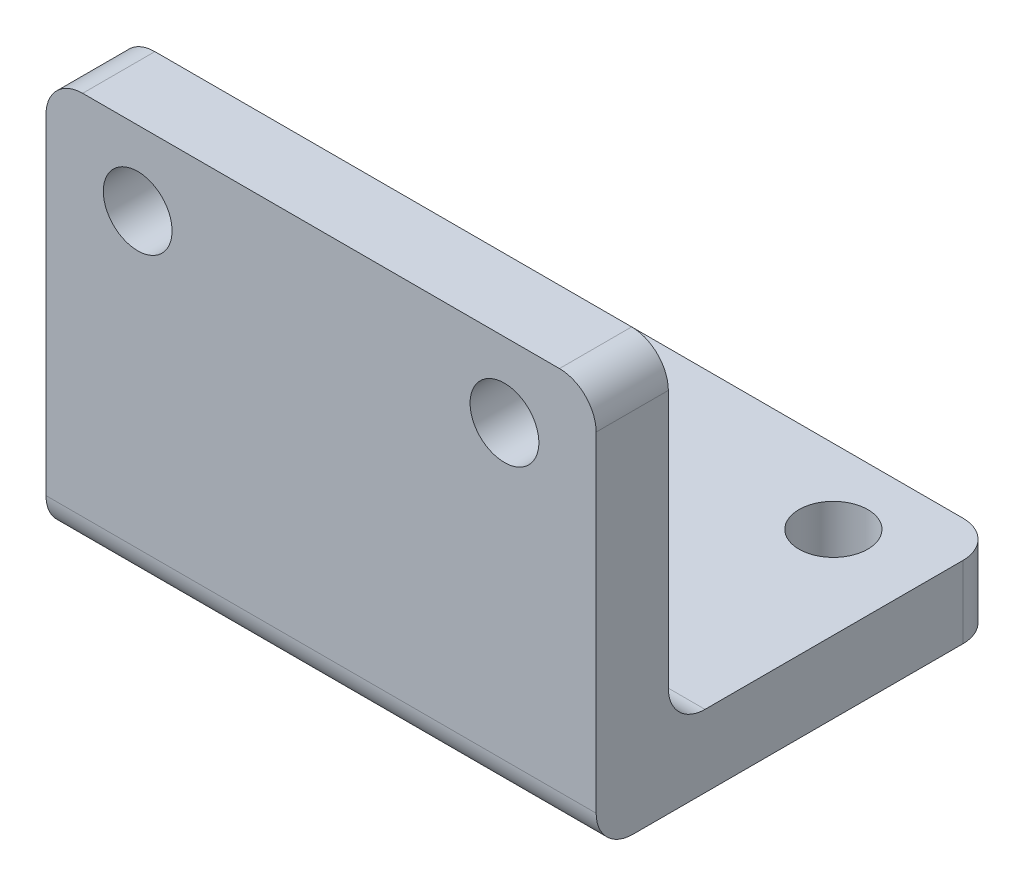
ISO-10303-21;
HEADER;
FILE_DESCRIPTION(('STEP AP214'),'2;1');
FILE_NAME('part.step','',(''),(''),'','','');
FILE_SCHEMA(('AUTOMOTIVE_DESIGN { 1 0 10303 214 1 1 1 1 }'));
ENDSEC;
DATA;
#1=APPLICATION_CONTEXT('core data for automotive mechanical design processes');
#2=APPLICATION_PROTOCOL_DEFINITION('international standard','automotive_design',2000,#1);
#3=PRODUCT_CONTEXT('',#1,'mechanical');
#4=PRODUCT('Part','Part','',(#3));
#5=PRODUCT_RELATED_PRODUCT_CATEGORY('part','',(#4));
#6=PRODUCT_DEFINITION_FORMATION('','',#4);
#7=PRODUCT_DEFINITION_CONTEXT('part definition',#1,'design');
#8=PRODUCT_DEFINITION('design','',#6,#7);
#9=PRODUCT_DEFINITION_SHAPE('','',#8);
#10=(LENGTH_UNIT() NAMED_UNIT(*) SI_UNIT(.MILLI.,.METRE.));
#11=(NAMED_UNIT(*) PLANE_ANGLE_UNIT() SI_UNIT($,.RADIAN.));
#12=(NAMED_UNIT(*) SI_UNIT($,.STERADIAN.) SOLID_ANGLE_UNIT());
#13=UNCERTAINTY_MEASURE_WITH_UNIT(LENGTH_MEASURE(1.E-05),#10,'distance_accuracy_value','');
#14=(GEOMETRIC_REPRESENTATION_CONTEXT(3) GLOBAL_UNCERTAINTY_ASSIGNED_CONTEXT((#13)) GLOBAL_UNIT_ASSIGNED_CONTEXT((#10,
#11,#12)) REPRESENTATION_CONTEXT('',''));
#15=CARTESIAN_POINT('',(0.,0.,0.));
#16=DIRECTION('',(0.,0.,1.));
#17=DIRECTION('',(1.,0.,0.));
#18=AXIS2_PLACEMENT_3D('',#15,#16,#17);
#19=CARTESIAN_POINT('',(38.1,5.,-5.));
#20=DIRECTION('',(0.,0.,1.));
#21=DIRECTION('',(1.,0.,0.));
#22=AXIS2_PLACEMENT_3D('',#19,#20,#21);
#23=PLANE('',#22);
#24=CARTESIAN_POINT('',(31.75,22.78,-5.));
#25=DIRECTION('',(0.,0.,-1.));
#26=DIRECTION('',(-1.,0.,0.));
#27=AXIS2_PLACEMENT_3D('',#24,#25,#26);
#28=CIRCLE('',#27,2.38125);
#29=CARTESIAN_POINT('',(29.36875,22.78,-5.));
#30=VERTEX_POINT('',#29);
#31=EDGE_CURVE('E284',#30,#30,#28,.T.);
#32=ORIENTED_EDGE('',*,*,#31,.F.);
#33=EDGE_LOOP('',(#32));
#34=FACE_BOUND('',#33,.T.);
#35=CARTESIAN_POINT('',(6.35000000000002,22.78,-5.));
#36=DIRECTION('',(0.,0.,-1.));
#37=DIRECTION('',(-1.,0.,0.));
#38=AXIS2_PLACEMENT_3D('',#35,#36,#37);
#39=CIRCLE('',#38,2.38125);
#40=CARTESIAN_POINT('',(3.96875000000001,22.78,-5.));
#41=VERTEX_POINT('',#40);
#42=EDGE_CURVE('E279',#41,#41,#39,.T.);
#43=ORIENTED_EDGE('',*,*,#42,.F.);
#44=EDGE_LOOP('',(#43));
#45=FACE_BOUND('',#44,.T.);
#46=DIRECTION('',(0.,1.,0.));
#47=VECTOR('',#46,1.);
#48=CARTESIAN_POINT('',(0.,5.,-5.));
#49=LINE('',#48,#47);
#50=CARTESIAN_POINT('',(0.,7.54,-5.));
#51=VERTEX_POINT('',#50);
#52=CARTESIAN_POINT('',(0.,25.4,-5.));
#53=VERTEX_POINT('',#52);
#54=EDGE_CURVE('E174',#51,#53,#49,.T.);
#55=ORIENTED_EDGE('',*,*,#54,.T.);
#56=CARTESIAN_POINT('',(2.54,25.4,-5.));
#57=DIRECTION('',(0.,0.,1.));
#58=DIRECTION('',(1.,0.,0.));
#59=AXIS2_PLACEMENT_3D('',#56,#57,#58);
#60=CIRCLE('',#59,2.54);
#61=CARTESIAN_POINT('',(2.54000000000001,27.94,-5.));
#62=VERTEX_POINT('',#61);
#63=EDGE_CURVE('E59',#53,#62,#60,.F.);
#64=ORIENTED_EDGE('',*,*,#63,.T.);
#65=DIRECTION('',(-1.,0.,0.));
#66=VECTOR('',#65,1.);
#67=CARTESIAN_POINT('',(38.1,27.94,-5.));
#68=LINE('',#67,#66);
#69=CARTESIAN_POINT('',(35.56,27.94,-5.));
#70=VERTEX_POINT('',#69);
#71=EDGE_CURVE('E241',#70,#62,#68,.T.);
#72=ORIENTED_EDGE('',*,*,#71,.F.);
#73=CARTESIAN_POINT('',(35.56,25.4,-5.));
#74=DIRECTION('',(0.,0.,1.));
#75=DIRECTION('',(1.,0.,0.));
#76=AXIS2_PLACEMENT_3D('',#73,#74,#75);
#77=CIRCLE('',#76,2.54);
#78=CARTESIAN_POINT('',(38.1,25.4,-5.));
#79=VERTEX_POINT('',#78);
#80=EDGE_CURVE('E151',#70,#79,#77,.F.);
#81=ORIENTED_EDGE('',*,*,#80,.T.);
#82=DIRECTION('',(0.,1.,0.));
#83=VECTOR('',#82,1.);
#84=CARTESIAN_POINT('',(38.1,5.,-5.));
#85=LINE('',#84,#83);
#86=CARTESIAN_POINT('',(38.1,7.54,-5.));
#87=VERTEX_POINT('',#86);
#88=EDGE_CURVE('E139',#87,#79,#85,.T.);
#89=ORIENTED_EDGE('',*,*,#88,.F.);
#90=DIRECTION('',(-1.,0.,0.));
#91=VECTOR('',#90,1.);
#92=CARTESIAN_POINT('',(0.,7.54,-5.));
#93=LINE('',#92,#91);
#94=EDGE_CURVE('E148',#87,#51,#93,.T.);
#95=ORIENTED_EDGE('',*,*,#94,.T.);
#96=EDGE_LOOP('',(#55,#64,#72,#81,#89,#95));
#97=FACE_BOUND('',#96,.T.);
#98=ADVANCED_FACE('F43',(#34,#45,#97),#23,.F.);
#99=CARTESIAN_POINT('',(38.1,27.94,0.));
#100=DIRECTION('',(0.,-1.,0.));
#101=DIRECTION('',(0.,0.,-1.));
#102=AXIS2_PLACEMENT_3D('',#99,#100,#101);
#103=PLANE('',#102);
#104=ORIENTED_EDGE('',*,*,#71,.T.);
#105=DIRECTION('',(0.,0.,1.));
#106=VECTOR('',#105,1.);
#107=CARTESIAN_POINT('',(2.54,27.94,0.));
#108=LINE('',#107,#106);
#109=CARTESIAN_POINT('',(2.54000000000001,27.94,0.));
#110=VERTEX_POINT('',#109);
#111=EDGE_CURVE('E224',#62,#110,#108,.T.);
#112=ORIENTED_EDGE('',*,*,#111,.T.);
#113=DIRECTION('',(-1.,0.,0.));
#114=VECTOR('',#113,1.);
#115=CARTESIAN_POINT('',(38.1,27.94,0.));
#116=LINE('',#115,#114);
#117=CARTESIAN_POINT('',(35.56,27.94,0.));
#118=VERTEX_POINT('',#117);
#119=EDGE_CURVE('E235',#118,#110,#116,.T.);
#120=ORIENTED_EDGE('',*,*,#119,.F.);
#121=DIRECTION('',(0.,0.,1.));
#122=VECTOR('',#121,1.);
#123=CARTESIAN_POINT('',(35.56,27.94,0.));
#124=LINE('',#123,#122);
#125=EDGE_CURVE('E66',#118,#70,#124,.F.);
#126=ORIENTED_EDGE('',*,*,#125,.T.);
#127=EDGE_LOOP('',(#104,#112,#120,#126));
#128=FACE_BOUND('',#127,.T.);
#129=ADVANCED_FACE('F238',(#128),#103,.F.);
#130=CARTESIAN_POINT('',(38.1,0.,0.));
#131=DIRECTION('',(0.,0.,-1.));
#132=DIRECTION('',(-1.,0.,0.));
#133=AXIS2_PLACEMENT_3D('',#130,#131,#132);
#134=PLANE('',#133);
#135=CARTESIAN_POINT('',(31.75,22.78,0.));
#136=DIRECTION('',(0.,0.,-1.));
#137=DIRECTION('',(-1.,0.,0.));
#138=AXIS2_PLACEMENT_3D('',#135,#136,#137);
#139=CIRCLE('',#138,2.38125);
#140=CARTESIAN_POINT('',(29.36875,22.78,0.));
#141=VERTEX_POINT('',#140);
#142=EDGE_CURVE('E267',#141,#141,#139,.T.);
#143=ORIENTED_EDGE('',*,*,#142,.T.);
#144=EDGE_LOOP('',(#143));
#145=FACE_BOUND('',#144,.T.);
#146=CARTESIAN_POINT('',(6.35000000000002,22.78,0.));
#147=DIRECTION('',(0.,0.,-1.));
#148=DIRECTION('',(-1.,0.,0.));
#149=AXIS2_PLACEMENT_3D('',#146,#147,#148);
#150=CIRCLE('',#149,2.38125);
#151=CARTESIAN_POINT('',(3.96875000000001,22.78,0.));
#152=VERTEX_POINT('',#151);
#153=EDGE_CURVE('E275',#152,#152,#150,.T.);
#154=ORIENTED_EDGE('',*,*,#153,.T.);
#155=EDGE_LOOP('',(#154));
#156=FACE_BOUND('',#155,.T.);
#157=ORIENTED_EDGE('',*,*,#119,.T.);
#158=CARTESIAN_POINT('',(2.54,25.4,0.));
#159=DIRECTION('',(0.,0.,-1.));
#160=DIRECTION('',(-1.,0.,0.));
#161=AXIS2_PLACEMENT_3D('',#158,#159,#160);
#162=CIRCLE('',#161,2.54);
#163=CARTESIAN_POINT('',(0.,25.4,0.));
#164=VERTEX_POINT('',#163);
#165=EDGE_CURVE('E158',#110,#164,#162,.F.);
#166=ORIENTED_EDGE('',*,*,#165,.T.);
#167=DIRECTION('',(0.,-1.,0.));
#168=VECTOR('',#167,1.);
#169=CARTESIAN_POINT('',(0.,0.,0.));
#170=LINE('',#169,#168);
#171=CARTESIAN_POINT('',(0.,2.54,0.));
#172=VERTEX_POINT('',#171);
#173=EDGE_CURVE('E261',#164,#172,#170,.T.);
#174=ORIENTED_EDGE('',*,*,#173,.T.);
#175=DIRECTION('',(-1.,0.,0.));
#176=VECTOR('',#175,1.);
#177=CARTESIAN_POINT('',(38.1,2.54,0.));
#178=LINE('',#177,#176);
#179=CARTESIAN_POINT('',(38.1,2.54,0.));
#180=VERTEX_POINT('',#179);
#181=EDGE_CURVE('E228',#172,#180,#178,.F.);
#182=ORIENTED_EDGE('',*,*,#181,.T.);
#183=DIRECTION('',(0.,-1.,0.));
#184=VECTOR('',#183,1.);
#185=CARTESIAN_POINT('',(38.1,0.,0.));
#186=LINE('',#185,#184);
#187=CARTESIAN_POINT('',(38.1,25.4,0.));
#188=VERTEX_POINT('',#187);
#189=EDGE_CURVE('E153',#188,#180,#186,.T.);
#190=ORIENTED_EDGE('',*,*,#189,.F.);
#191=CARTESIAN_POINT('',(35.56,25.4,0.));
#192=DIRECTION('',(0.,0.,-1.));
#193=DIRECTION('',(-1.,0.,0.));
#194=AXIS2_PLACEMENT_3D('',#191,#192,#193);
#195=CIRCLE('',#194,2.54);
#196=EDGE_CURVE('E163',#188,#118,#195,.F.);
#197=ORIENTED_EDGE('',*,*,#196,.T.);
#198=EDGE_LOOP('',(#157,#166,#174,#182,#190,#197));
#199=FACE_BOUND('',#198,.T.);
#200=ADVANCED_FACE('F234',(#145,#156,#199),#134,.F.);
#201=CARTESIAN_POINT('',(38.1,0.,0.));
#202=DIRECTION('',(0.,1.,0.));
#203=DIRECTION('',(0.,0.,1.));
#204=AXIS2_PLACEMENT_3D('',#201,#202,#203);
#205=PLANE('',#204);
#206=CARTESIAN_POINT('',(6.35000000000002,0.,-22.78));
#207=DIRECTION('',(0.,1.,0.));
#208=DIRECTION('',(0.,0.,1.));
#209=AXIS2_PLACEMENT_3D('',#206,#207,#208);
#210=CIRCLE('',#209,2.38125);
#211=CARTESIAN_POINT('',(6.35000000000002,0.,-20.39875));
#212=VERTEX_POINT('',#211);
#213=EDGE_CURVE('E280',#212,#212,#210,.T.);
#214=ORIENTED_EDGE('',*,*,#213,.T.);
#215=EDGE_LOOP('',(#214));
#216=FACE_BOUND('',#215,.T.);
#217=CARTESIAN_POINT('',(31.75,0.,-22.78));
#218=DIRECTION('',(0.,1.,0.));
#219=DIRECTION('',(0.,0.,1.));
#220=AXIS2_PLACEMENT_3D('',#217,#218,#219);
#221=CIRCLE('',#220,2.38125);
#222=CARTESIAN_POINT('',(31.75,0.,-20.39875));
#223=VERTEX_POINT('',#222);
#224=EDGE_CURVE('E291',#223,#223,#221,.T.);
#225=ORIENTED_EDGE('',*,*,#224,.T.);
#226=EDGE_LOOP('',(#225));
#227=FACE_BOUND('',#226,.T.);
#228=DIRECTION('',(-1.,0.,0.));
#229=VECTOR('',#228,1.);
#230=CARTESIAN_POINT('',(38.1,0.,-27.94));
#231=LINE('',#230,#229);
#232=CARTESIAN_POINT('',(35.56,0.,-27.94));
#233=VERTEX_POINT('',#232);
#234=CARTESIAN_POINT('',(2.54000000000001,0.,-27.94));
#235=VERTEX_POINT('',#234);
#236=EDGE_CURVE('E242',#233,#235,#231,.T.);
#237=ORIENTED_EDGE('',*,*,#236,.F.);
#238=CARTESIAN_POINT('',(35.56,0.,-25.4));
#239=DIRECTION('',(0.,1.,0.));
#240=DIRECTION('',(0.,0.,1.));
#241=AXIS2_PLACEMENT_3D('',#238,#239,#240);
#242=CIRCLE('',#241,2.54);
#243=CARTESIAN_POINT('',(38.1,0.,-25.4));
#244=VERTEX_POINT('',#243);
#245=EDGE_CURVE('E210',#233,#244,#242,.F.);
#246=ORIENTED_EDGE('',*,*,#245,.T.);
#247=DIRECTION('',(0.,0.,-1.));
#248=VECTOR('',#247,1.);
#249=CARTESIAN_POINT('',(38.1,0.,0.));
#250=LINE('',#249,#248);
#251=CARTESIAN_POINT('',(38.1,0.,-2.54));
#252=VERTEX_POINT('',#251);
#253=EDGE_CURVE('E270',#252,#244,#250,.T.);
#254=ORIENTED_EDGE('',*,*,#253,.F.);
#255=DIRECTION('',(-1.,0.,0.));
#256=VECTOR('',#255,1.);
#257=CARTESIAN_POINT('',(38.1,0.,-2.54));
#258=LINE('',#257,#256);
#259=CARTESIAN_POINT('',(0.,0.,-2.54));
#260=VERTEX_POINT('',#259);
#261=EDGE_CURVE('E203',#252,#260,#258,.T.);
#262=ORIENTED_EDGE('',*,*,#261,.T.);
#263=DIRECTION('',(0.,0.,-1.));
#264=VECTOR('',#263,1.);
#265=CARTESIAN_POINT('',(0.,0.,0.));
#266=LINE('',#265,#264);
#267=CARTESIAN_POINT('',(0.,0.,-25.4));
#268=VERTEX_POINT('',#267);
#269=EDGE_CURVE('E181',#260,#268,#266,.T.);
#270=ORIENTED_EDGE('',*,*,#269,.T.);
#271=CARTESIAN_POINT('',(2.54,0.,-25.4));
#272=DIRECTION('',(0.,1.,0.));
#273=DIRECTION('',(0.,0.,1.));
#274=AXIS2_PLACEMENT_3D('',#271,#272,#273);
#275=CIRCLE('',#274,2.54);
#276=EDGE_CURVE('E207',#268,#235,#275,.F.);
#277=ORIENTED_EDGE('',*,*,#276,.T.);
#278=EDGE_LOOP('',(#237,#246,#254,#262,#270,#277));
#279=FACE_BOUND('',#278,.T.);
#280=ADVANCED_FACE('F307',(#216,#227,#279),#205,.F.);
#281=CARTESIAN_POINT('',(38.1,0.,-27.94));
#282=DIRECTION('',(0.,0.,1.));
#283=DIRECTION('',(0.,-1.,0.));
#284=AXIS2_PLACEMENT_3D('',#281,#282,#283);
#285=PLANE('',#284);
#286=DIRECTION('',(-1.,0.,0.));
#287=VECTOR('',#286,1.);
#288=CARTESIAN_POINT('',(38.1,5.,-27.94));
#289=LINE('',#288,#287);
#290=CARTESIAN_POINT('',(35.56,5.,-27.94));
#291=VERTEX_POINT('',#290);
#292=CARTESIAN_POINT('',(2.54000000000001,5.,-27.94));
#293=VERTEX_POINT('',#292);
#294=EDGE_CURVE('E255',#291,#293,#289,.T.);
#295=ORIENTED_EDGE('',*,*,#294,.F.);
#296=DIRECTION('',(0.,1.,0.));
#297=VECTOR('',#296,1.);
#298=CARTESIAN_POINT('',(35.56,0.,-27.94));
#299=LINE('',#298,#297);
#300=EDGE_CURVE('E200',#291,#233,#299,.F.);
#301=ORIENTED_EDGE('',*,*,#300,.T.);
#302=ORIENTED_EDGE('',*,*,#236,.T.);
#303=DIRECTION('',(0.,1.,0.));
#304=VECTOR('',#303,1.);
#305=CARTESIAN_POINT('',(2.54,5.,-27.94));
#306=LINE('',#305,#304);
#307=EDGE_CURVE('E196',#235,#293,#306,.T.);
#308=ORIENTED_EDGE('',*,*,#307,.T.);
#309=EDGE_LOOP('',(#295,#301,#302,#308));
#310=FACE_BOUND('',#309,.T.);
#311=ADVANCED_FACE('F319',(#310),#285,.F.);
#312=CARTESIAN_POINT('',(38.1,5.,-5.));
#313=DIRECTION('',(0.,-1.,0.));
#314=DIRECTION('',(0.,0.,-1.));
#315=AXIS2_PLACEMENT_3D('',#312,#313,#314);
#316=PLANE('',#315);
#317=CARTESIAN_POINT('',(6.35000000000002,5.,-22.78));
#318=DIRECTION('',(0.,1.,0.));
#319=DIRECTION('',(0.,0.,1.));
#320=AXIS2_PLACEMENT_3D('',#317,#318,#319);
#321=CIRCLE('',#320,2.38125);
#322=CARTESIAN_POINT('',(6.35000000000002,5.,-20.39875));
#323=VERTEX_POINT('',#322);
#324=EDGE_CURVE('E299',#323,#323,#321,.T.);
#325=ORIENTED_EDGE('',*,*,#324,.F.);
#326=EDGE_LOOP('',(#325));
#327=FACE_BOUND('',#326,.T.);
#328=CARTESIAN_POINT('',(31.75,5.,-22.78));
#329=DIRECTION('',(0.,1.,0.));
#330=DIRECTION('',(0.,0.,1.));
#331=AXIS2_PLACEMENT_3D('',#328,#329,#330);
#332=CIRCLE('',#331,2.38125);
#333=CARTESIAN_POINT('',(31.75,5.,-20.39875));
#334=VERTEX_POINT('',#333);
#335=EDGE_CURVE('E295',#334,#334,#332,.T.);
#336=ORIENTED_EDGE('',*,*,#335,.F.);
#337=EDGE_LOOP('',(#336));
#338=FACE_BOUND('',#337,.T.);
#339=DIRECTION('',(0.,0.,1.));
#340=VECTOR('',#339,1.);
#341=CARTESIAN_POINT('',(38.1,5.,-5.));
#342=LINE('',#341,#340);
#343=CARTESIAN_POINT('',(38.1,5.,-25.4));
#344=VERTEX_POINT('',#343);
#345=CARTESIAN_POINT('',(38.1,5.,-7.54));
#346=VERTEX_POINT('',#345);
#347=EDGE_CURVE('E143',#344,#346,#342,.T.);
#348=ORIENTED_EDGE('',*,*,#347,.F.);
#349=CARTESIAN_POINT('',(35.56,5.,-25.4));
#350=DIRECTION('',(0.,-1.,0.));
#351=DIRECTION('',(0.,0.,-1.));
#352=AXIS2_PLACEMENT_3D('',#349,#350,#351);
#353=CIRCLE('',#352,2.54);
#354=EDGE_CURVE('E188',#344,#291,#353,.F.);
#355=ORIENTED_EDGE('',*,*,#354,.T.);
#356=ORIENTED_EDGE('',*,*,#294,.T.);
#357=CARTESIAN_POINT('',(2.54,5.,-25.4));
#358=DIRECTION('',(0.,-1.,0.));
#359=DIRECTION('',(0.,0.,-1.));
#360=AXIS2_PLACEMENT_3D('',#357,#358,#359);
#361=CIRCLE('',#360,2.54);
#362=CARTESIAN_POINT('',(0.,5.,-25.4));
#363=VERTEX_POINT('',#362);
#364=EDGE_CURVE('E179',#293,#363,#361,.F.);
#365=ORIENTED_EDGE('',*,*,#364,.T.);
#366=DIRECTION('',(0.,0.,1.));
#367=VECTOR('',#366,1.);
#368=CARTESIAN_POINT('',(0.,5.,-5.));
#369=LINE('',#368,#367);
#370=CARTESIAN_POINT('',(0.,5.,-7.54));
#371=VERTEX_POINT('',#370);
#372=EDGE_CURVE('E154',#363,#371,#369,.T.);
#373=ORIENTED_EDGE('',*,*,#372,.T.);
#374=DIRECTION('',(-1.,0.,0.));
#375=VECTOR('',#374,1.);
#376=CARTESIAN_POINT('',(38.1,5.,-7.54));
#377=LINE('',#376,#375);
#378=EDGE_CURVE('E177',#371,#346,#377,.F.);
#379=ORIENTED_EDGE('',*,*,#378,.T.);
#380=EDGE_LOOP('',(#348,#355,#356,#365,#373,#379));
#381=FACE_BOUND('',#380,.T.);
#382=ADVANCED_FACE('F176',(#327,#338,#381),#316,.F.);
#383=CARTESIAN_POINT('',(38.1,0.,0.));
#384=DIRECTION('',(-1.,0.,0.));
#385=DIRECTION('',(0.,0.,1.));
#386=AXIS2_PLACEMENT_3D('',#383,#384,#385);
#387=PLANE('',#386);
#388=ORIENTED_EDGE('',*,*,#253,.T.);
#389=DIRECTION('',(0.,1.,0.));
#390=VECTOR('',#389,1.);
#391=CARTESIAN_POINT('',(38.1,0.,-25.4));
#392=LINE('',#391,#390);
#393=EDGE_CURVE('E184',#244,#344,#392,.T.);
#394=ORIENTED_EDGE('',*,*,#393,.T.);
#395=ORIENTED_EDGE('',*,*,#347,.T.);
#396=CARTESIAN_POINT('',(38.1,7.54,-7.54));
#397=DIRECTION('',(-1.,0.,0.));
#398=DIRECTION('',(0.,0.,1.));
#399=AXIS2_PLACEMENT_3D('',#396,#397,#398);
#400=CIRCLE('',#399,2.54);
#401=EDGE_CURVE('E11',#346,#87,#400,.T.);
#402=ORIENTED_EDGE('',*,*,#401,.T.);
#403=ORIENTED_EDGE('',*,*,#88,.T.);
#404=DIRECTION('',(0.,0.,1.));
#405=VECTOR('',#404,1.);
#406=CARTESIAN_POINT('',(38.1,25.4,0.));
#407=LINE('',#406,#405);
#408=EDGE_CURVE('E190',#79,#188,#407,.T.);
#409=ORIENTED_EDGE('',*,*,#408,.T.);
#410=ORIENTED_EDGE('',*,*,#189,.T.);
#411=CARTESIAN_POINT('',(38.1,2.54,-2.54));
#412=DIRECTION('',(-1.,0.,0.));
#413=DIRECTION('',(0.,0.,1.));
#414=AXIS2_PLACEMENT_3D('',#411,#412,#413);
#415=CIRCLE('',#414,2.54);
#416=EDGE_CURVE('E246',#180,#252,#415,.F.);
#417=ORIENTED_EDGE('',*,*,#416,.T.);
#418=EDGE_LOOP('',(#388,#394,#395,#402,#403,#409,#410,#417));
#419=FACE_BOUND('',#418,.T.);
#420=ADVANCED_FACE('F137',(#419),#387,.F.);
#421=CARTESIAN_POINT('',(0.,0.,0.));
#422=DIRECTION('',(-1.,0.,0.));
#423=DIRECTION('',(0.,0.,1.));
#424=AXIS2_PLACEMENT_3D('',#421,#422,#423);
#425=PLANE('',#424);
#426=ORIENTED_EDGE('',*,*,#372,.F.);
#427=DIRECTION('',(0.,1.,0.));
#428=VECTOR('',#427,1.);
#429=CARTESIAN_POINT('',(0.,0.,-25.4));
#430=LINE('',#429,#428);
#431=EDGE_CURVE('E219',#363,#268,#430,.F.);
#432=ORIENTED_EDGE('',*,*,#431,.T.);
#433=ORIENTED_EDGE('',*,*,#269,.F.);
#434=CARTESIAN_POINT('',(0.,2.54,-2.54));
#435=DIRECTION('',(-1.,0.,0.));
#436=DIRECTION('',(0.,0.,1.));
#437=AXIS2_PLACEMENT_3D('',#434,#435,#436);
#438=CIRCLE('',#437,2.54);
#439=EDGE_CURVE('E213',#260,#172,#438,.T.);
#440=ORIENTED_EDGE('',*,*,#439,.T.);
#441=ORIENTED_EDGE('',*,*,#173,.F.);
#442=DIRECTION('',(0.,0.,1.));
#443=VECTOR('',#442,1.);
#444=CARTESIAN_POINT('',(0.,25.4,-5.));
#445=LINE('',#444,#443);
#446=EDGE_CURVE('E216',#164,#53,#445,.F.);
#447=ORIENTED_EDGE('',*,*,#446,.T.);
#448=ORIENTED_EDGE('',*,*,#54,.F.);
#449=CARTESIAN_POINT('',(0.,7.54,-7.54));
#450=DIRECTION('',(-1.,0.,0.));
#451=DIRECTION('',(0.,0.,1.));
#452=AXIS2_PLACEMENT_3D('',#449,#450,#451);
#453=CIRCLE('',#452,2.54);
#454=EDGE_CURVE('E52',#51,#371,#453,.F.);
#455=ORIENTED_EDGE('',*,*,#454,.T.);
#456=EDGE_LOOP('',(#426,#432,#433,#440,#441,#447,#448,#455));
#457=FACE_BOUND('',#456,.T.);
#458=ADVANCED_FACE('F172',(#457),#425,.T.);
#459=CARTESIAN_POINT('',(35.56,0.,-25.4));
#460=DIRECTION('',(0.,1.,0.));
#461=DIRECTION('',(0.,0.,1.));
#462=AXIS2_PLACEMENT_3D('',#459,#460,#461);
#463=CYLINDRICAL_SURFACE('',#462,2.54);
#464=ORIENTED_EDGE('',*,*,#245,.F.);
#465=ORIENTED_EDGE('',*,*,#300,.F.);
#466=ORIENTED_EDGE('',*,*,#354,.F.);
#467=ORIENTED_EDGE('',*,*,#393,.F.);
#468=EDGE_LOOP('',(#464,#465,#466,#467));
#469=FACE_BOUND('',#468,.T.);
#470=ADVANCED_FACE('F345',(#469),#463,.T.);
#471=CARTESIAN_POINT('',(2.54,0.,-25.4));
#472=DIRECTION('',(0.,-1.,0.));
#473=DIRECTION('',(0.,0.,-1.));
#474=AXIS2_PLACEMENT_3D('',#471,#472,#473);
#475=CYLINDRICAL_SURFACE('',#474,2.54);
#476=ORIENTED_EDGE('',*,*,#276,.F.);
#477=ORIENTED_EDGE('',*,*,#431,.F.);
#478=ORIENTED_EDGE('',*,*,#364,.F.);
#479=ORIENTED_EDGE('',*,*,#307,.F.);
#480=EDGE_LOOP('',(#476,#477,#478,#479));
#481=FACE_BOUND('',#480,.T.);
#482=ADVANCED_FACE('F348',(#481),#475,.T.);
#483=CARTESIAN_POINT('',(2.54,25.4,0.));
#484=DIRECTION('',(0.,0.,-1.));
#485=DIRECTION('',(-1.,0.,0.));
#486=AXIS2_PLACEMENT_3D('',#483,#484,#485);
#487=CYLINDRICAL_SURFACE('',#486,2.54);
#488=ORIENTED_EDGE('',*,*,#63,.F.);
#489=ORIENTED_EDGE('',*,*,#446,.F.);
#490=ORIENTED_EDGE('',*,*,#165,.F.);
#491=ORIENTED_EDGE('',*,*,#111,.F.);
#492=EDGE_LOOP('',(#488,#489,#490,#491));
#493=FACE_BOUND('',#492,.T.);
#494=ADVANCED_FACE('F352',(#493),#487,.T.);
#495=CARTESIAN_POINT('',(35.56,25.4,0.));
#496=DIRECTION('',(0.,0.,1.));
#497=DIRECTION('',(1.,0.,0.));
#498=AXIS2_PLACEMENT_3D('',#495,#496,#497);
#499=CYLINDRICAL_SURFACE('',#498,2.54);
#500=ORIENTED_EDGE('',*,*,#80,.F.);
#501=ORIENTED_EDGE('',*,*,#125,.F.);
#502=ORIENTED_EDGE('',*,*,#196,.F.);
#503=ORIENTED_EDGE('',*,*,#408,.F.);
#504=EDGE_LOOP('',(#500,#501,#502,#503));
#505=FACE_BOUND('',#504,.T.);
#506=ADVANCED_FACE('F244',(#505),#499,.T.);
#507=CARTESIAN_POINT('',(38.1,7.54,-7.54));
#508=DIRECTION('',(1.,0.,0.));
#509=DIRECTION('',(0.,0.,-1.));
#510=AXIS2_PLACEMENT_3D('',#507,#508,#509);
#511=CYLINDRICAL_SURFACE('',#510,2.54);
#512=ORIENTED_EDGE('',*,*,#401,.F.);
#513=ORIENTED_EDGE('',*,*,#378,.F.);
#514=ORIENTED_EDGE('',*,*,#454,.F.);
#515=ORIENTED_EDGE('',*,*,#94,.F.);
#516=EDGE_LOOP('',(#512,#513,#514,#515));
#517=FACE_BOUND('',#516,.T.);
#518=ADVANCED_FACE('F156',(#517),#511,.F.);
#519=CARTESIAN_POINT('',(38.1,2.54,-2.54));
#520=DIRECTION('',(-1.,0.,0.));
#521=DIRECTION('',(0.,0.,1.));
#522=AXIS2_PLACEMENT_3D('',#519,#520,#521);
#523=CYLINDRICAL_SURFACE('',#522,2.54);
#524=ORIENTED_EDGE('',*,*,#416,.F.);
#525=ORIENTED_EDGE('',*,*,#181,.F.);
#526=ORIENTED_EDGE('',*,*,#439,.F.);
#527=ORIENTED_EDGE('',*,*,#261,.F.);
#528=EDGE_LOOP('',(#524,#525,#526,#527));
#529=FACE_BOUND('',#528,.T.);
#530=ADVANCED_FACE('F45',(#529),#523,.T.);
#531=CARTESIAN_POINT('',(6.35000000000002,22.78,0.));
#532=DIRECTION('',(0.,0.,-1.));
#533=DIRECTION('',(-1.,0.,0.));
#534=AXIS2_PLACEMENT_3D('',#531,#532,#533);
#535=CYLINDRICAL_SURFACE('',#534,2.38125);
#536=ORIENTED_EDGE('',*,*,#153,.F.);
#537=EDGE_LOOP('',(#536));
#538=FACE_BOUND('',#537,.T.);
#539=ORIENTED_EDGE('',*,*,#42,.T.);
#540=EDGE_LOOP('',(#539));
#541=FACE_BOUND('',#540,.T.);
#542=ADVANCED_FACE('F330',(#538,#541),#535,.F.);
#543=CARTESIAN_POINT('',(31.75,22.78,0.));
#544=DIRECTION('',(0.,0.,-1.));
#545=DIRECTION('',(-1.,0.,0.));
#546=AXIS2_PLACEMENT_3D('',#543,#544,#545);
#547=CYLINDRICAL_SURFACE('',#546,2.38125);
#548=ORIENTED_EDGE('',*,*,#142,.F.);
#549=EDGE_LOOP('',(#548));
#550=FACE_BOUND('',#549,.T.);
#551=ORIENTED_EDGE('',*,*,#31,.T.);
#552=EDGE_LOOP('',(#551));
#553=FACE_BOUND('',#552,.T.);
#554=ADVANCED_FACE('F324',(#550,#553),#547,.F.);
#555=CARTESIAN_POINT('',(31.75,0.,-22.78));
#556=DIRECTION('',(0.,1.,0.));
#557=DIRECTION('',(0.,0.,1.));
#558=AXIS2_PLACEMENT_3D('',#555,#556,#557);
#559=CYLINDRICAL_SURFACE('',#558,2.38125);
#560=ORIENTED_EDGE('',*,*,#224,.F.);
#561=EDGE_LOOP('',(#560));
#562=FACE_BOUND('',#561,.T.);
#563=ORIENTED_EDGE('',*,*,#335,.T.);
#564=EDGE_LOOP('',(#563));
#565=FACE_BOUND('',#564,.T.);
#566=ADVANCED_FACE('F313',(#562,#565),#559,.F.);
#567=CARTESIAN_POINT('',(6.35000000000002,0.,-22.78));
#568=DIRECTION('',(0.,1.,0.));
#569=DIRECTION('',(0.,0.,1.));
#570=AXIS2_PLACEMENT_3D('',#567,#568,#569);
#571=CYLINDRICAL_SURFACE('',#570,2.38125);
#572=ORIENTED_EDGE('',*,*,#213,.F.);
#573=EDGE_LOOP('',(#572));
#574=FACE_BOUND('',#573,.T.);
#575=ORIENTED_EDGE('',*,*,#324,.T.);
#576=EDGE_LOOP('',(#575));
#577=FACE_BOUND('',#576,.T.);
#578=ADVANCED_FACE('F310',(#574,#577),#571,.F.);
#579=CLOSED_SHELL('',(#98,#129,#200,#280,#311,#382,#420,#458,#470,#482,#494,#506,#518,#530,#542,
#554,#566,#578));
#580=MANIFOLD_SOLID_BREP('B2',#579);
#581=ADVANCED_BREP_SHAPE_REPRESENTATION('',(#18,#580),#14);
#582=SHAPE_DEFINITION_REPRESENTATION(#9,#581);
ENDSEC;
END-ISO-10303-21;
